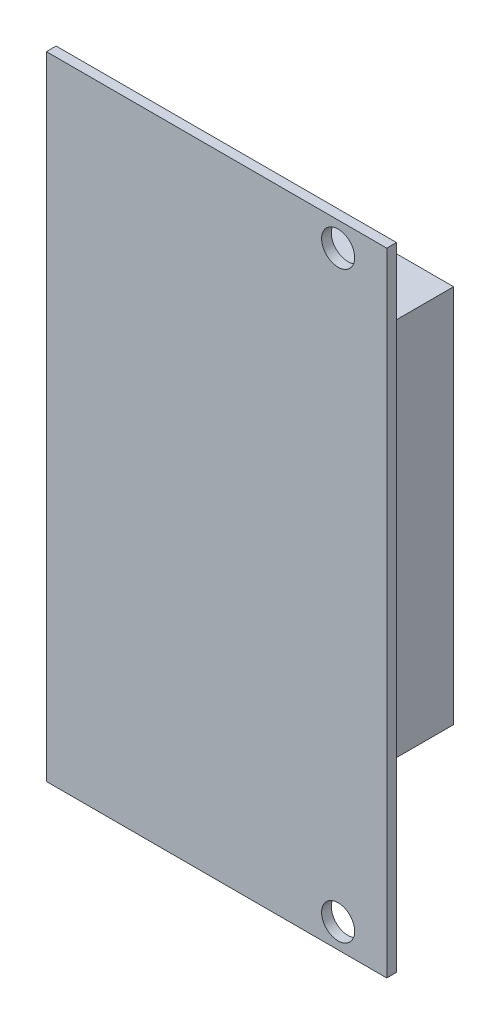
ISO-10303-21;
HEADER;
FILE_DESCRIPTION(('STEP AP214'),'2;1');
FILE_NAME('part.step','',(''),(''),'','','');
FILE_SCHEMA(('AUTOMOTIVE_DESIGN { 1 0 10303 214 1 1 1 1 }'));
ENDSEC;
DATA;
#1=APPLICATION_CONTEXT('core data for automotive mechanical design processes');
#2=APPLICATION_PROTOCOL_DEFINITION('international standard','automotive_design',2000,#1);
#3=PRODUCT_CONTEXT('',#1,'mechanical');
#4=PRODUCT('Part','Part','',(#3));
#5=PRODUCT_RELATED_PRODUCT_CATEGORY('part','',(#4));
#6=PRODUCT_DEFINITION_FORMATION('','',#4);
#7=PRODUCT_DEFINITION_CONTEXT('part definition',#1,'design');
#8=PRODUCT_DEFINITION('design','',#6,#7);
#9=PRODUCT_DEFINITION_SHAPE('','',#8);
#10=(LENGTH_UNIT() NAMED_UNIT(*) SI_UNIT(.MILLI.,.METRE.));
#11=(NAMED_UNIT(*) PLANE_ANGLE_UNIT() SI_UNIT($,.RADIAN.));
#12=(NAMED_UNIT(*) SI_UNIT($,.STERADIAN.) SOLID_ANGLE_UNIT());
#13=UNCERTAINTY_MEASURE_WITH_UNIT(LENGTH_MEASURE(1.E-05),#10,'distance_accuracy_value','');
#14=(GEOMETRIC_REPRESENTATION_CONTEXT(3) GLOBAL_UNCERTAINTY_ASSIGNED_CONTEXT((#13)) GLOBAL_UNIT_ASSIGNED_CONTEXT((#10,
#11,#12)) REPRESENTATION_CONTEXT('',''));
#15=CARTESIAN_POINT('',(0.,0.,0.));
#16=DIRECTION('',(0.,0.,1.));
#17=DIRECTION('',(1.,0.,0.));
#18=AXIS2_PLACEMENT_3D('',#15,#16,#17);
#19=CARTESIAN_POINT('',(0.,0.,0.));
#20=DIRECTION('',(0.,0.,-1.));
#21=DIRECTION('',(-1.,0.,0.));
#22=AXIS2_PLACEMENT_3D('',#19,#20,#21);
#23=PLANE('',#22);
#24=DIRECTION('',(0.,1.,0.));
#25=VECTOR('',#24,1.);
#26=CARTESIAN_POINT('',(17.5,-32.5,0.));
#27=LINE('',#26,#25);
#28=CARTESIAN_POINT('',(17.5,-32.5,0.));
#29=VERTEX_POINT('',#28);
#30=CARTESIAN_POINT('',(17.5,32.5,0.));
#31=VERTEX_POINT('',#30);
#32=EDGE_CURVE('E153',#29,#31,#27,.T.);
#33=ORIENTED_EDGE('',*,*,#32,.T.);
#34=DIRECTION('',(-1.,0.,0.));
#35=VECTOR('',#34,1.);
#36=CARTESIAN_POINT('',(-17.5,32.5,0.));
#37=LINE('',#36,#35);
#38=CARTESIAN_POINT('',(-17.5,32.5,0.));
#39=VERTEX_POINT('',#38);
#40=EDGE_CURVE('E167',#31,#39,#37,.T.);
#41=ORIENTED_EDGE('',*,*,#40,.T.);
#42=DIRECTION('',(0.,-1.,0.));
#43=VECTOR('',#42,1.);
#44=CARTESIAN_POINT('',(-17.5,-32.5,0.));
#45=LINE('',#44,#43);
#46=CARTESIAN_POINT('',(-17.5,-32.5,0.));
#47=VERTEX_POINT('',#46);
#48=EDGE_CURVE('E173',#39,#47,#45,.T.);
#49=ORIENTED_EDGE('',*,*,#48,.T.);
#50=DIRECTION('',(1.,0.,0.));
#51=VECTOR('',#50,1.);
#52=CARTESIAN_POINT('',(-17.5,-32.5,0.));
#53=LINE('',#52,#51);
#54=EDGE_CURVE('E159',#47,#29,#53,.T.);
#55=ORIENTED_EDGE('',*,*,#54,.T.);
#56=EDGE_LOOP('',(#33,#41,#49,#55));
#57=FACE_BOUND('',#56,.T.);
#58=CARTESIAN_POINT('',(12.5,30.,1.2E-05));
#59=DIRECTION('',(0.,0.,1.));
#60=DIRECTION('',(1.,0.,0.));
#61=AXIS2_PLACEMENT_3D('',#58,#59,#60);
#62=CIRCLE('',#61,1.7);
#63=CARTESIAN_POINT('',(14.2,30.,1.2E-05));
#64=VERTEX_POINT('',#63);
#65=EDGE_CURVE('E186',#64,#64,#62,.T.);
#66=ORIENTED_EDGE('',*,*,#65,.F.);
#67=EDGE_LOOP('',(#66));
#68=FACE_BOUND('',#67,.T.);
#69=CARTESIAN_POINT('',(12.5,-30.,1.2E-05));
#70=DIRECTION('',(0.,0.,1.));
#71=DIRECTION('',(1.,0.,0.));
#72=AXIS2_PLACEMENT_3D('',#69,#70,#71);
#73=CIRCLE('',#72,1.7);
#74=CARTESIAN_POINT('',(14.2,-30.,1.2E-05));
#75=VERTEX_POINT('',#74);
#76=EDGE_CURVE('E182',#75,#75,#73,.T.);
#77=ORIENTED_EDGE('',*,*,#76,.F.);
#78=EDGE_LOOP('',(#77));
#79=FACE_BOUND('',#78,.T.);
#80=ADVANCED_FACE('F39',(#57,#68,#79),#23,.F.);
#81=CARTESIAN_POINT('',(17.5,-32.5,-1.));
#82=DIRECTION('',(1.,0.,0.));
#83=DIRECTION('',(0.,0.,-1.));
#84=AXIS2_PLACEMENT_3D('',#81,#82,#83);
#85=PLANE('',#84);
#86=ORIENTED_EDGE('',*,*,#32,.F.);
#87=DIRECTION('',(0.,0.,1.));
#88=VECTOR('',#87,1.);
#89=CARTESIAN_POINT('',(17.5,-32.5,-1.));
#90=LINE('',#89,#88);
#91=CARTESIAN_POINT('',(17.5,-32.5,-1.));
#92=VERTEX_POINT('',#91);
#93=EDGE_CURVE('E11',#92,#29,#90,.T.);
#94=ORIENTED_EDGE('',*,*,#93,.F.);
#95=DIRECTION('',(0.,1.,0.));
#96=VECTOR('',#95,1.);
#97=CARTESIAN_POINT('',(17.5,-32.5,-1.));
#98=LINE('',#97,#96);
#99=CARTESIAN_POINT('',(17.5,32.5,-1.));
#100=VERTEX_POINT('',#99);
#101=EDGE_CURVE('E152',#92,#100,#98,.T.);
#102=ORIENTED_EDGE('',*,*,#101,.T.);
#103=DIRECTION('',(0.,0.,1.));
#104=VECTOR('',#103,1.);
#105=CARTESIAN_POINT('',(17.5,32.5,-1.));
#106=LINE('',#105,#104);
#107=EDGE_CURVE('E170',#100,#31,#106,.T.);
#108=ORIENTED_EDGE('',*,*,#107,.T.);
#109=EDGE_LOOP('',(#86,#94,#102,#108));
#110=FACE_BOUND('',#109,.T.);
#111=ADVANCED_FACE('F41',(#110),#85,.T.);
#112=CARTESIAN_POINT('',(-17.5,-32.5,-1.));
#113=DIRECTION('',(0.,-1.,0.));
#114=DIRECTION('',(0.,0.,-1.));
#115=AXIS2_PLACEMENT_3D('',#112,#113,#114);
#116=PLANE('',#115);
#117=ORIENTED_EDGE('',*,*,#54,.F.);
#118=DIRECTION('',(0.,0.,1.));
#119=VECTOR('',#118,1.);
#120=CARTESIAN_POINT('',(-17.5,-32.5,-1.));
#121=LINE('',#120,#119);
#122=CARTESIAN_POINT('',(-17.5,-32.5,-1.));
#123=VERTEX_POINT('',#122);
#124=EDGE_CURVE('E49',#123,#47,#121,.T.);
#125=ORIENTED_EDGE('',*,*,#124,.F.);
#126=DIRECTION('',(1.,0.,0.));
#127=VECTOR('',#126,1.);
#128=CARTESIAN_POINT('',(-17.5,-32.5,-1.));
#129=LINE('',#128,#127);
#130=EDGE_CURVE('E165',#123,#92,#129,.T.);
#131=ORIENTED_EDGE('',*,*,#130,.T.);
#132=ORIENTED_EDGE('',*,*,#93,.T.);
#133=EDGE_LOOP('',(#117,#125,#131,#132));
#134=FACE_BOUND('',#133,.T.);
#135=ADVANCED_FACE('F203',(#134),#116,.T.);
#136=CARTESIAN_POINT('',(-17.5,-32.5,-1.));
#137=DIRECTION('',(-1.,0.,0.));
#138=DIRECTION('',(0.,0.,1.));
#139=AXIS2_PLACEMENT_3D('',#136,#137,#138);
#140=PLANE('',#139);
#141=ORIENTED_EDGE('',*,*,#48,.F.);
#142=DIRECTION('',(0.,0.,1.));
#143=VECTOR('',#142,1.);
#144=CARTESIAN_POINT('',(-17.5,32.5,-1.));
#145=LINE('',#144,#143);
#146=CARTESIAN_POINT('',(-17.5,32.5,-1.));
#147=VERTEX_POINT('',#146);
#148=EDGE_CURVE('E177',#147,#39,#145,.T.);
#149=ORIENTED_EDGE('',*,*,#148,.F.);
#150=DIRECTION('',(0.,-1.,0.));
#151=VECTOR('',#150,1.);
#152=CARTESIAN_POINT('',(-17.5,-32.5,-1.));
#153=LINE('',#152,#151);
#154=EDGE_CURVE('E163',#147,#123,#153,.T.);
#155=ORIENTED_EDGE('',*,*,#154,.T.);
#156=ORIENTED_EDGE('',*,*,#124,.T.);
#157=EDGE_LOOP('',(#141,#149,#155,#156));
#158=FACE_BOUND('',#157,.T.);
#159=ADVANCED_FACE('F209',(#158),#140,.T.);
#160=CARTESIAN_POINT('',(-17.5,32.5,-1.));
#161=DIRECTION('',(0.,1.,0.));
#162=DIRECTION('',(0.,0.,1.));
#163=AXIS2_PLACEMENT_3D('',#160,#161,#162);
#164=PLANE('',#163);
#165=ORIENTED_EDGE('',*,*,#40,.F.);
#166=ORIENTED_EDGE('',*,*,#107,.F.);
#167=DIRECTION('',(-1.,0.,0.));
#168=VECTOR('',#167,1.);
#169=CARTESIAN_POINT('',(-17.5,32.5,-1.));
#170=LINE('',#169,#168);
#171=EDGE_CURVE('E160',#100,#147,#170,.T.);
#172=ORIENTED_EDGE('',*,*,#171,.T.);
#173=ORIENTED_EDGE('',*,*,#148,.T.);
#174=EDGE_LOOP('',(#165,#166,#172,#173));
#175=FACE_BOUND('',#174,.T.);
#176=ADVANCED_FACE('F215',(#175),#164,.T.);
#177=CARTESIAN_POINT('',(0.,0.,-1.));
#178=DIRECTION('',(0.,0.,-1.));
#179=DIRECTION('',(-1.,0.,0.));
#180=AXIS2_PLACEMENT_3D('',#177,#178,#179);
#181=PLANE('',#180);
#182=CARTESIAN_POINT('',(12.5,-30.,-1.));
#183=DIRECTION('',(0.,0.,-1.));
#184=DIRECTION('',(-1.,0.,0.));
#185=AXIS2_PLACEMENT_3D('',#182,#183,#184);
#186=CIRCLE('',#185,1.7);
#187=CARTESIAN_POINT('',(10.8,-30.,-1.));
#188=VERTEX_POINT('',#187);
#189=EDGE_CURVE('E128',#188,#188,#186,.F.);
#190=ORIENTED_EDGE('',*,*,#189,.T.);
#191=EDGE_LOOP('',(#190));
#192=FACE_BOUND('',#191,.T.);
#193=CARTESIAN_POINT('',(12.5,30.,-1.));
#194=DIRECTION('',(0.,0.,-1.));
#195=DIRECTION('',(-1.,0.,0.));
#196=AXIS2_PLACEMENT_3D('',#193,#194,#195);
#197=CIRCLE('',#196,1.7);
#198=CARTESIAN_POINT('',(10.8,30.,-1.));
#199=VERTEX_POINT('',#198);
#200=EDGE_CURVE('E133',#199,#199,#197,.F.);
#201=ORIENTED_EDGE('',*,*,#200,.T.);
#202=EDGE_LOOP('',(#201));
#203=FACE_BOUND('',#202,.T.);
#204=DIRECTION('',(0.,-1.,0.));
#205=VECTOR('',#204,1.);
#206=CARTESIAN_POINT('',(11.375,0.,-1.));
#207=LINE('',#206,#205);
#208=CARTESIAN_POINT('',(11.375,19.5,-1.));
#209=VERTEX_POINT('',#208);
#210=CARTESIAN_POINT('',(11.375,-19.5,-1.));
#211=VERTEX_POINT('',#210);
#212=EDGE_CURVE('E151',#209,#211,#207,.T.);
#213=ORIENTED_EDGE('',*,*,#212,.F.);
#214=DIRECTION('',(1.,0.,0.));
#215=VECTOR('',#214,1.);
#216=CARTESIAN_POINT('',(0.,19.5,-1.));
#217=LINE('',#216,#215);
#218=CARTESIAN_POINT('',(-11.375,19.5,-1.));
#219=VERTEX_POINT('',#218);
#220=EDGE_CURVE('E111',#219,#209,#217,.T.);
#221=ORIENTED_EDGE('',*,*,#220,.F.);
#222=DIRECTION('',(0.,1.,0.));
#223=VECTOR('',#222,1.);
#224=CARTESIAN_POINT('',(-11.375,0.,-1.));
#225=LINE('',#224,#223);
#226=CARTESIAN_POINT('',(-11.375,-19.5,-1.));
#227=VERTEX_POINT('',#226);
#228=EDGE_CURVE('E64',#227,#219,#225,.T.);
#229=ORIENTED_EDGE('',*,*,#228,.F.);
#230=DIRECTION('',(-1.,0.,0.));
#231=VECTOR('',#230,1.);
#232=CARTESIAN_POINT('',(0.,-19.5,-1.));
#233=LINE('',#232,#231);
#234=EDGE_CURVE('E59',#211,#227,#233,.T.);
#235=ORIENTED_EDGE('',*,*,#234,.F.);
#236=EDGE_LOOP('',(#213,#221,#229,#235));
#237=FACE_BOUND('',#236,.T.);
#238=ORIENTED_EDGE('',*,*,#101,.F.);
#239=ORIENTED_EDGE('',*,*,#130,.F.);
#240=ORIENTED_EDGE('',*,*,#154,.F.);
#241=ORIENTED_EDGE('',*,*,#171,.F.);
#242=EDGE_LOOP('',(#238,#239,#240,#241));
#243=FACE_BOUND('',#242,.T.);
#244=ADVANCED_FACE('F204',(#192,#203,#237,#243),#181,.T.);
#245=CARTESIAN_POINT('',(11.375,-19.5,-13.));
#246=DIRECTION('',(1.,0.,0.));
#247=DIRECTION('',(0.,0.,-1.));
#248=AXIS2_PLACEMENT_3D('',#245,#246,#247);
#249=PLANE('',#248);
#250=DIRECTION('',(0.,0.,1.));
#251=VECTOR('',#250,1.);
#252=CARTESIAN_POINT('',(11.375,19.5,-13.));
#253=LINE('',#252,#251);
#254=CARTESIAN_POINT('',(11.375,19.5,-13.));
#255=VERTEX_POINT('',#254);
#256=EDGE_CURVE('E106',#255,#209,#253,.T.);
#257=ORIENTED_EDGE('',*,*,#256,.T.);
#258=ORIENTED_EDGE('',*,*,#212,.T.);
#259=DIRECTION('',(0.,0.,1.));
#260=VECTOR('',#259,1.);
#261=CARTESIAN_POINT('',(11.375,-19.5,-13.));
#262=LINE('',#261,#260);
#263=CARTESIAN_POINT('',(11.375,-19.5,-13.));
#264=VERTEX_POINT('',#263);
#265=EDGE_CURVE('E126',#264,#211,#262,.T.);
#266=ORIENTED_EDGE('',*,*,#265,.F.);
#267=DIRECTION('',(0.,1.,0.));
#268=VECTOR('',#267,1.);
#269=CARTESIAN_POINT('',(11.375,-19.5,-13.));
#270=LINE('',#269,#268);
#271=EDGE_CURVE('E125',#264,#255,#270,.T.);
#272=ORIENTED_EDGE('',*,*,#271,.T.);
#273=EDGE_LOOP('',(#257,#258,#266,#272));
#274=FACE_BOUND('',#273,.T.);
#275=ADVANCED_FACE('F130',(#274),#249,.T.);
#276=CARTESIAN_POINT('',(-11.375,-19.5,-13.));
#277=DIRECTION('',(0.,-1.,0.));
#278=DIRECTION('',(0.,0.,-1.));
#279=AXIS2_PLACEMENT_3D('',#276,#277,#278);
#280=PLANE('',#279);
#281=ORIENTED_EDGE('',*,*,#265,.T.);
#282=ORIENTED_EDGE('',*,*,#234,.T.);
#283=DIRECTION('',(0.,0.,1.));
#284=VECTOR('',#283,1.);
#285=CARTESIAN_POINT('',(-11.375,-19.5,-13.));
#286=LINE('',#285,#284);
#287=CARTESIAN_POINT('',(-11.375,-19.5,-13.));
#288=VERTEX_POINT('',#287);
#289=EDGE_CURVE('E144',#288,#227,#286,.T.);
#290=ORIENTED_EDGE('',*,*,#289,.F.);
#291=DIRECTION('',(1.,0.,0.));
#292=VECTOR('',#291,1.);
#293=CARTESIAN_POINT('',(-11.375,-19.5,-13.));
#294=LINE('',#293,#292);
#295=EDGE_CURVE('E114',#288,#264,#294,.T.);
#296=ORIENTED_EDGE('',*,*,#295,.T.);
#297=EDGE_LOOP('',(#281,#282,#290,#296));
#298=FACE_BOUND('',#297,.T.);
#299=ADVANCED_FACE('F262',(#298),#280,.T.);
#300=CARTESIAN_POINT('',(-11.375,-19.5,-13.));
#301=DIRECTION('',(-1.,0.,0.));
#302=DIRECTION('',(0.,0.,1.));
#303=AXIS2_PLACEMENT_3D('',#300,#301,#302);
#304=PLANE('',#303);
#305=ORIENTED_EDGE('',*,*,#289,.T.);
#306=ORIENTED_EDGE('',*,*,#228,.T.);
#307=DIRECTION('',(0.,0.,1.));
#308=VECTOR('',#307,1.);
#309=CARTESIAN_POINT('',(-11.375,19.5,-13.));
#310=LINE('',#309,#308);
#311=CARTESIAN_POINT('',(-11.375,19.5,-13.));
#312=VERTEX_POINT('',#311);
#313=EDGE_CURVE('E112',#312,#219,#310,.T.);
#314=ORIENTED_EDGE('',*,*,#313,.F.);
#315=DIRECTION('',(0.,-1.,0.));
#316=VECTOR('',#315,1.);
#317=CARTESIAN_POINT('',(-11.375,-19.5,-13.));
#318=LINE('',#317,#316);
#319=EDGE_CURVE('E123',#312,#288,#318,.T.);
#320=ORIENTED_EDGE('',*,*,#319,.T.);
#321=EDGE_LOOP('',(#305,#306,#314,#320));
#322=FACE_BOUND('',#321,.T.);
#323=ADVANCED_FACE('F275',(#322),#304,.T.);
#324=CARTESIAN_POINT('',(-11.375,19.5,-13.));
#325=DIRECTION('',(0.,1.,0.));
#326=DIRECTION('',(0.,0.,1.));
#327=AXIS2_PLACEMENT_3D('',#324,#325,#326);
#328=PLANE('',#327);
#329=ORIENTED_EDGE('',*,*,#313,.T.);
#330=ORIENTED_EDGE('',*,*,#220,.T.);
#331=ORIENTED_EDGE('',*,*,#256,.F.);
#332=DIRECTION('',(-1.,0.,0.));
#333=VECTOR('',#332,1.);
#334=CARTESIAN_POINT('',(-11.375,19.5,-13.));
#335=LINE('',#334,#333);
#336=EDGE_CURVE('E109',#255,#312,#335,.T.);
#337=ORIENTED_EDGE('',*,*,#336,.T.);
#338=EDGE_LOOP('',(#329,#330,#331,#337));
#339=FACE_BOUND('',#338,.T.);
#340=ADVANCED_FACE('F107',(#339),#328,.T.);
#341=CARTESIAN_POINT('',(0.,0.,-13.));
#342=DIRECTION('',(0.,0.,-1.));
#343=DIRECTION('',(-1.,0.,0.));
#344=AXIS2_PLACEMENT_3D('',#341,#342,#343);
#345=PLANE('',#344);
#346=ORIENTED_EDGE('',*,*,#271,.F.);
#347=ORIENTED_EDGE('',*,*,#295,.F.);
#348=ORIENTED_EDGE('',*,*,#319,.F.);
#349=ORIENTED_EDGE('',*,*,#336,.F.);
#350=EDGE_LOOP('',(#346,#347,#348,#349));
#351=FACE_BOUND('',#350,.T.);
#352=ADVANCED_FACE('F119',(#351),#345,.T.);
#353=CARTESIAN_POINT('',(12.5,30.,1.2E-05));
#354=DIRECTION('',(0.,0.,-1.));
#355=DIRECTION('',(-1.,0.,0.));
#356=AXIS2_PLACEMENT_3D('',#353,#354,#355);
#357=CYLINDRICAL_SURFACE('',#356,1.7);
#358=ORIENTED_EDGE('',*,*,#200,.F.);
#359=EDGE_LOOP('',(#358));
#360=FACE_BOUND('',#359,.T.);
#361=ORIENTED_EDGE('',*,*,#65,.T.);
#362=EDGE_LOOP('',(#361));
#363=FACE_BOUND('',#362,.T.);
#364=ADVANCED_FACE('F299',(#360,#363),#357,.F.);
#365=CARTESIAN_POINT('',(12.5,-30.,1.2E-05));
#366=DIRECTION('',(0.,0.,-1.));
#367=DIRECTION('',(-1.,0.,0.));
#368=AXIS2_PLACEMENT_3D('',#365,#366,#367);
#369=CYLINDRICAL_SURFACE('',#368,1.7);
#370=ORIENTED_EDGE('',*,*,#189,.F.);
#371=EDGE_LOOP('',(#370));
#372=FACE_BOUND('',#371,.T.);
#373=ORIENTED_EDGE('',*,*,#76,.T.);
#374=EDGE_LOOP('',(#373));
#375=FACE_BOUND('',#374,.T.);
#376=ADVANCED_FACE('F312',(#372,#375),#369,.F.);
#377=CLOSED_SHELL('',(#80,#111,#135,#159,#176,#244,#275,#299,#323,#340,#352,#364,#376));
#378=MANIFOLD_SOLID_BREP('B2',#377);
#379=ADVANCED_BREP_SHAPE_REPRESENTATION('',(#18,#378),#14);
#380=SHAPE_DEFINITION_REPRESENTATION(#9,#379);
ENDSEC;
END-ISO-10303-21;
